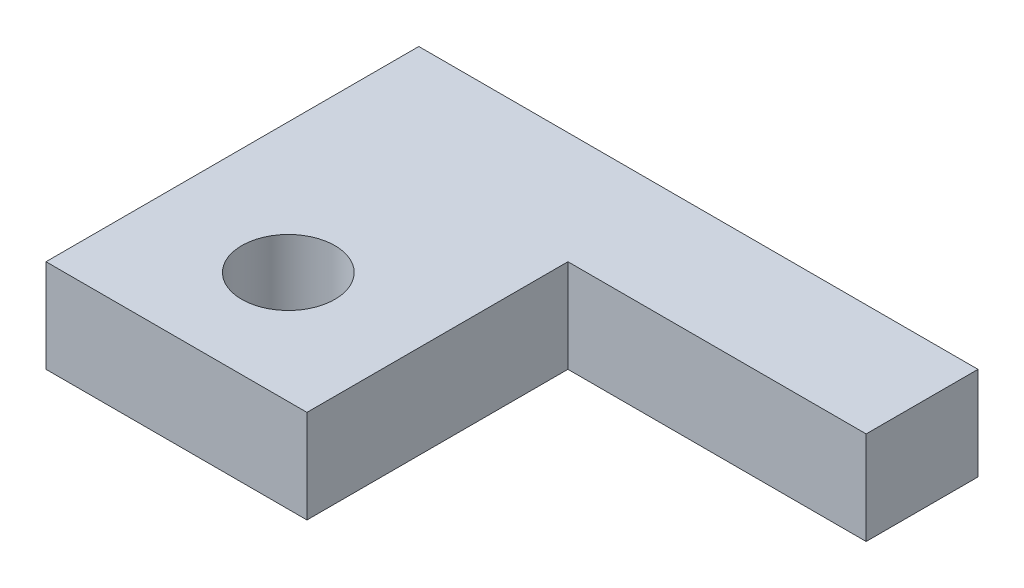
ISO-10303-21;
HEADER;
FILE_DESCRIPTION(('STEP AP214'),'2;1');
FILE_NAME('part.step','',(''),(''),'','','');
FILE_SCHEMA(('AUTOMOTIVE_DESIGN { 1 0 10303 214 1 1 1 1 }'));
ENDSEC;
DATA;
#1=APPLICATION_CONTEXT('core data for automotive mechanical design processes');
#2=APPLICATION_PROTOCOL_DEFINITION('international standard','automotive_design',2000,#1);
#3=PRODUCT_CONTEXT('',#1,'mechanical');
#4=PRODUCT('Part','Part','',(#3));
#5=PRODUCT_RELATED_PRODUCT_CATEGORY('part','',(#4));
#6=PRODUCT_DEFINITION_FORMATION('','',#4);
#7=PRODUCT_DEFINITION_CONTEXT('part definition',#1,'design');
#8=PRODUCT_DEFINITION('design','',#6,#7);
#9=PRODUCT_DEFINITION_SHAPE('','',#8);
#10=(LENGTH_UNIT() NAMED_UNIT(*) SI_UNIT(.MILLI.,.METRE.));
#11=(NAMED_UNIT(*) PLANE_ANGLE_UNIT() SI_UNIT($,.RADIAN.));
#12=(NAMED_UNIT(*) SI_UNIT($,.STERADIAN.) SOLID_ANGLE_UNIT());
#13=UNCERTAINTY_MEASURE_WITH_UNIT(LENGTH_MEASURE(1.E-05),#10,'distance_accuracy_value','');
#14=(GEOMETRIC_REPRESENTATION_CONTEXT(3) GLOBAL_UNCERTAINTY_ASSIGNED_CONTEXT((#13)) GLOBAL_UNIT_ASSIGNED_CONTEXT((#10,
#11,#12)) REPRESENTATION_CONTEXT('',''));
#15=CARTESIAN_POINT('',(0.,0.,0.));
#16=DIRECTION('',(0.,0.,1.));
#17=DIRECTION('',(1.,0.,0.));
#18=AXIS2_PLACEMENT_3D('',#15,#16,#17);
#19=CARTESIAN_POINT('',(-7.,2.5,0.));
#20=DIRECTION('',(-1.,0.,0.));
#21=DIRECTION('',(0.,0.,1.));
#22=AXIS2_PLACEMENT_3D('',#19,#20,#21);
#23=PLANE('',#22);
#24=DIRECTION('',(0.,0.,-1.));
#25=VECTOR('',#24,1.);
#26=CARTESIAN_POINT('',(-7.,0.,0.));
#27=LINE('',#26,#25);
#28=CARTESIAN_POINT('',(-7.,0.,0.));
#29=VERTEX_POINT('',#28);
#30=CARTESIAN_POINT('',(-7.,0.,-10.));
#31=VERTEX_POINT('',#30);
#32=EDGE_CURVE('E146',#29,#31,#27,.T.);
#33=ORIENTED_EDGE('',*,*,#32,.F.);
#34=DIRECTION('',(0.,-1.,0.));
#35=VECTOR('',#34,1.);
#36=CARTESIAN_POINT('',(-7.,2.5,0.));
#37=LINE('',#36,#35);
#38=CARTESIAN_POINT('',(-7.,2.5,0.));
#39=VERTEX_POINT('',#38);
#40=EDGE_CURVE('E11',#39,#29,#37,.T.);
#41=ORIENTED_EDGE('',*,*,#40,.F.);
#42=DIRECTION('',(0.,0.,-1.));
#43=VECTOR('',#42,1.);
#44=CARTESIAN_POINT('',(-7.,2.5,0.));
#45=LINE('',#44,#43);
#46=CARTESIAN_POINT('',(-7.,2.5,-10.));
#47=VERTEX_POINT('',#46);
#48=EDGE_CURVE('E198',#39,#47,#45,.T.);
#49=ORIENTED_EDGE('',*,*,#48,.T.);
#50=DIRECTION('',(0.,-1.,0.));
#51=VECTOR('',#50,1.);
#52=CARTESIAN_POINT('',(-7.,2.5,-10.));
#53=LINE('',#52,#51);
#54=EDGE_CURVE('E59',#47,#31,#53,.T.);
#55=ORIENTED_EDGE('',*,*,#54,.T.);
#56=EDGE_LOOP('',(#33,#41,#49,#55));
#57=FACE_BOUND('',#56,.T.);
#58=ADVANCED_FACE('F41',(#57),#23,.T.);
#59=CARTESIAN_POINT('',(0.,2.5,0.));
#60=DIRECTION('',(0.,0.,1.));
#61=DIRECTION('',(1.,0.,0.));
#62=AXIS2_PLACEMENT_3D('',#59,#60,#61);
#63=PLANE('',#62);
#64=DIRECTION('',(-1.,0.,0.));
#65=VECTOR('',#64,1.);
#66=CARTESIAN_POINT('',(0.,0.,0.));
#67=LINE('',#66,#65);
#68=CARTESIAN_POINT('',(0.,0.,0.));
#69=VERTEX_POINT('',#68);
#70=EDGE_CURVE('E141',#69,#29,#67,.T.);
#71=ORIENTED_EDGE('',*,*,#70,.F.);
#72=DIRECTION('',(0.,-1.,0.));
#73=VECTOR('',#72,1.);
#74=CARTESIAN_POINT('',(0.,2.5,0.));
#75=LINE('',#74,#73);
#76=CARTESIAN_POINT('',(0.,2.5,0.));
#77=VERTEX_POINT('',#76);
#78=EDGE_CURVE('E51',#77,#69,#75,.T.);
#79=ORIENTED_EDGE('',*,*,#78,.F.);
#80=DIRECTION('',(-1.,0.,0.));
#81=VECTOR('',#80,1.);
#82=CARTESIAN_POINT('',(0.,2.5,0.));
#83=LINE('',#82,#81);
#84=EDGE_CURVE('E201',#77,#39,#83,.T.);
#85=ORIENTED_EDGE('',*,*,#84,.T.);
#86=ORIENTED_EDGE('',*,*,#40,.T.);
#87=EDGE_LOOP('',(#71,#79,#85,#86));
#88=FACE_BOUND('',#87,.T.);
#89=ADVANCED_FACE('F144',(#88),#63,.T.);
#90=CARTESIAN_POINT('',(0.,2.5,0.));
#91=DIRECTION('',(-1.,0.,0.));
#92=DIRECTION('',(0.,0.,1.));
#93=AXIS2_PLACEMENT_3D('',#90,#91,#92);
#94=PLANE('',#93);
#95=DIRECTION('',(0.,0.,-1.));
#96=VECTOR('',#95,1.);
#97=CARTESIAN_POINT('',(0.,0.,0.));
#98=LINE('',#97,#96);
#99=CARTESIAN_POINT('',(0.,0.,-7.));
#100=VERTEX_POINT('',#99);
#101=EDGE_CURVE('E134',#69,#100,#98,.T.);
#102=ORIENTED_EDGE('',*,*,#101,.T.);
#103=DIRECTION('',(0.,-1.,0.));
#104=VECTOR('',#103,1.);
#105=CARTESIAN_POINT('',(0.,2.5,-7.));
#106=LINE('',#105,#104);
#107=CARTESIAN_POINT('',(0.,2.5,-7.));
#108=VERTEX_POINT('',#107);
#109=EDGE_CURVE('E122',#108,#100,#106,.T.);
#110=ORIENTED_EDGE('',*,*,#109,.F.);
#111=DIRECTION('',(0.,0.,-1.));
#112=VECTOR('',#111,1.);
#113=CARTESIAN_POINT('',(0.,2.5,0.));
#114=LINE('',#113,#112);
#115=EDGE_CURVE('E113',#77,#108,#114,.T.);
#116=ORIENTED_EDGE('',*,*,#115,.F.);
#117=ORIENTED_EDGE('',*,*,#78,.T.);
#118=EDGE_LOOP('',(#102,#110,#116,#117));
#119=FACE_BOUND('',#118,.T.);
#120=ADVANCED_FACE('F133',(#119),#94,.F.);
#121=CARTESIAN_POINT('',(0.,2.5,-7.));
#122=DIRECTION('',(0.,0.,-1.));
#123=DIRECTION('',(-1.,0.,0.));
#124=AXIS2_PLACEMENT_3D('',#121,#122,#123);
#125=PLANE('',#124);
#126=DIRECTION('',(1.,0.,0.));
#127=VECTOR('',#126,1.);
#128=CARTESIAN_POINT('',(0.,0.,-7.));
#129=LINE('',#128,#127);
#130=CARTESIAN_POINT('',(8.,0.,-7.));
#131=VERTEX_POINT('',#130);
#132=EDGE_CURVE('E120',#100,#131,#129,.T.);
#133=ORIENTED_EDGE('',*,*,#132,.T.);
#134=DIRECTION('',(0.,-1.,0.));
#135=VECTOR('',#134,1.);
#136=CARTESIAN_POINT('',(8.,2.5,-7.));
#137=LINE('',#136,#135);
#138=CARTESIAN_POINT('',(8.,2.5,-7.));
#139=VERTEX_POINT('',#138);
#140=EDGE_CURVE('E101',#139,#131,#137,.T.);
#141=ORIENTED_EDGE('',*,*,#140,.F.);
#142=DIRECTION('',(1.,0.,0.));
#143=VECTOR('',#142,1.);
#144=CARTESIAN_POINT('',(0.,2.5,-7.));
#145=LINE('',#144,#143);
#146=EDGE_CURVE('E107',#108,#139,#145,.T.);
#147=ORIENTED_EDGE('',*,*,#146,.F.);
#148=ORIENTED_EDGE('',*,*,#109,.T.);
#149=EDGE_LOOP('',(#133,#141,#147,#148));
#150=FACE_BOUND('',#149,.T.);
#151=ADVANCED_FACE('F119',(#150),#125,.F.);
#152=CARTESIAN_POINT('',(8.,2.5,0.));
#153=DIRECTION('',(-1.,0.,0.));
#154=DIRECTION('',(0.,0.,1.));
#155=AXIS2_PLACEMENT_3D('',#152,#153,#154);
#156=PLANE('',#155);
#157=DIRECTION('',(0.,0.,-1.));
#158=VECTOR('',#157,1.);
#159=CARTESIAN_POINT('',(8.,0.,0.));
#160=LINE('',#159,#158);
#161=CARTESIAN_POINT('',(8.,0.,-10.));
#162=VERTEX_POINT('',#161);
#163=EDGE_CURVE('E155',#131,#162,#160,.T.);
#164=ORIENTED_EDGE('',*,*,#163,.T.);
#165=DIRECTION('',(0.,-1.,0.));
#166=VECTOR('',#165,1.);
#167=CARTESIAN_POINT('',(8.,2.5,-10.));
#168=LINE('',#167,#166);
#169=CARTESIAN_POINT('',(8.,2.5,-10.));
#170=VERTEX_POINT('',#169);
#171=EDGE_CURVE('E79',#170,#162,#168,.T.);
#172=ORIENTED_EDGE('',*,*,#171,.F.);
#173=DIRECTION('',(0.,0.,-1.));
#174=VECTOR('',#173,1.);
#175=CARTESIAN_POINT('',(8.,2.5,0.));
#176=LINE('',#175,#174);
#177=EDGE_CURVE('E97',#139,#170,#176,.T.);
#178=ORIENTED_EDGE('',*,*,#177,.F.);
#179=ORIENTED_EDGE('',*,*,#140,.T.);
#180=EDGE_LOOP('',(#164,#172,#178,#179));
#181=FACE_BOUND('',#180,.T.);
#182=ADVANCED_FACE('F99',(#181),#156,.F.);
#183=CARTESIAN_POINT('',(-3.5,2.5,-3.));
#184=DIRECTION('',(0.,-1.,0.));
#185=DIRECTION('',(0.,0.,-1.));
#186=AXIS2_PLACEMENT_3D('',#183,#184,#185);
#187=CYLINDRICAL_SURFACE('',#186,1.25);
#188=CARTESIAN_POINT('',(-3.5,2.5,-3.));
#189=DIRECTION('',(0.,1.,0.));
#190=DIRECTION('',(0.,0.,1.));
#191=AXIS2_PLACEMENT_3D('',#188,#189,#190);
#192=CIRCLE('',#191,1.25);
#193=CARTESIAN_POINT('',(-3.5,2.5,-1.75));
#194=VERTEX_POINT('',#193);
#195=EDGE_CURVE('E161',#194,#194,#192,.T.);
#196=ORIENTED_EDGE('',*,*,#195,.T.);
#197=EDGE_LOOP('',(#196));
#198=FACE_BOUND('',#197,.T.);
#199=CARTESIAN_POINT('',(-3.5,0.,-3.));
#200=DIRECTION('',(0.,1.,0.));
#201=DIRECTION('',(0.,0.,1.));
#202=AXIS2_PLACEMENT_3D('',#199,#200,#201);
#203=CIRCLE('',#202,1.25);
#204=CARTESIAN_POINT('',(-3.5,0.,-1.75));
#205=VERTEX_POINT('',#204);
#206=EDGE_CURVE('E149',#205,#205,#203,.T.);
#207=ORIENTED_EDGE('',*,*,#206,.F.);
#208=EDGE_LOOP('',(#207));
#209=FACE_BOUND('',#208,.T.);
#210=ADVANCED_FACE('F43',(#198,#209),#187,.F.);
#211=CARTESIAN_POINT('',(0.,2.5,-10.));
#212=DIRECTION('',(0.,0.,-1.));
#213=DIRECTION('',(-1.,0.,0.));
#214=AXIS2_PLACEMENT_3D('',#211,#212,#213);
#215=PLANE('',#214);
#216=DIRECTION('',(1.,0.,0.));
#217=VECTOR('',#216,1.);
#218=CARTESIAN_POINT('',(0.,0.,-10.));
#219=LINE('',#218,#217);
#220=EDGE_CURVE('E158',#31,#162,#219,.T.);
#221=ORIENTED_EDGE('',*,*,#220,.F.);
#222=ORIENTED_EDGE('',*,*,#54,.F.);
#223=DIRECTION('',(1.,0.,0.));
#224=VECTOR('',#223,1.);
#225=CARTESIAN_POINT('',(0.,2.5,-10.));
#226=LINE('',#225,#224);
#227=EDGE_CURVE('E106',#47,#170,#226,.T.);
#228=ORIENTED_EDGE('',*,*,#227,.T.);
#229=ORIENTED_EDGE('',*,*,#171,.T.);
#230=EDGE_LOOP('',(#221,#222,#228,#229));
#231=FACE_BOUND('',#230,.T.);
#232=ADVANCED_FACE('F171',(#231),#215,.T.);
#233=CARTESIAN_POINT('',(0.,2.5,0.));
#234=DIRECTION('',(0.,1.,0.));
#235=DIRECTION('',(0.,0.,1.));
#236=AXIS2_PLACEMENT_3D('',#233,#234,#235);
#237=PLANE('',#236);
#238=ORIENTED_EDGE('',*,*,#195,.F.);
#239=EDGE_LOOP('',(#238));
#240=FACE_BOUND('',#239,.T.);
#241=ORIENTED_EDGE('',*,*,#48,.F.);
#242=ORIENTED_EDGE('',*,*,#84,.F.);
#243=ORIENTED_EDGE('',*,*,#115,.T.);
#244=ORIENTED_EDGE('',*,*,#146,.T.);
#245=ORIENTED_EDGE('',*,*,#177,.T.);
#246=ORIENTED_EDGE('',*,*,#227,.F.);
#247=EDGE_LOOP('',(#241,#242,#243,#244,#245,#246));
#248=FACE_BOUND('',#247,.T.);
#249=ADVANCED_FACE('F110',(#240,#248),#237,.T.);
#250=CARTESIAN_POINT('',(0.,0.,0.));
#251=DIRECTION('',(0.,1.,0.));
#252=DIRECTION('',(0.,0.,1.));
#253=AXIS2_PLACEMENT_3D('',#250,#251,#252);
#254=PLANE('',#253);
#255=ORIENTED_EDGE('',*,*,#206,.T.);
#256=EDGE_LOOP('',(#255));
#257=FACE_BOUND('',#256,.T.);
#258=ORIENTED_EDGE('',*,*,#32,.T.);
#259=ORIENTED_EDGE('',*,*,#220,.T.);
#260=ORIENTED_EDGE('',*,*,#163,.F.);
#261=ORIENTED_EDGE('',*,*,#132,.F.);
#262=ORIENTED_EDGE('',*,*,#101,.F.);
#263=ORIENTED_EDGE('',*,*,#70,.T.);
#264=EDGE_LOOP('',(#258,#259,#260,#261,#262,#263));
#265=FACE_BOUND('',#264,.T.);
#266=ADVANCED_FACE('F140',(#257,#265),#254,.F.);
#267=CLOSED_SHELL('',(#58,#89,#120,#151,#182,#210,#232,#249,#266));
#268=MANIFOLD_SOLID_BREP('B2',#267);
#269=ADVANCED_BREP_SHAPE_REPRESENTATION('',(#18,#268),#14);
#270=SHAPE_DEFINITION_REPRESENTATION(#9,#269);
ENDSEC;
END-ISO-10303-21;
